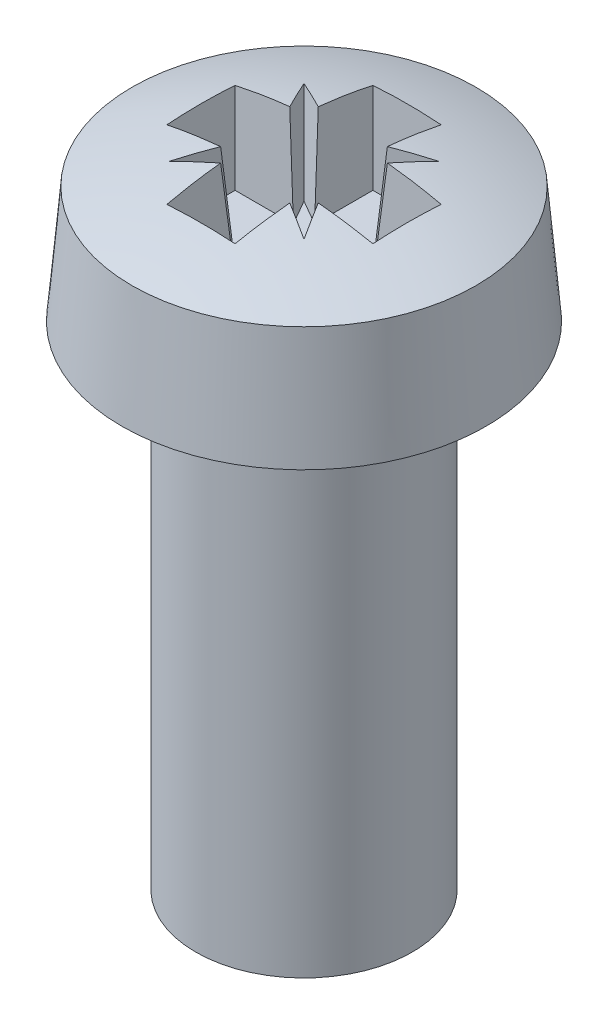
ISO-10303-21;
HEADER;
FILE_DESCRIPTION(('STEP AP214'),'2;1');
FILE_NAME('part.step','',(''),(''),'','','');
FILE_SCHEMA(('AUTOMOTIVE_DESIGN { 1 0 10303 214 1 1 1 1 }'));
ENDSEC;
DATA;
#1=APPLICATION_CONTEXT('core data for automotive mechanical design processes');
#2=APPLICATION_PROTOCOL_DEFINITION('international standard','automotive_design',2000,#1);
#3=PRODUCT_CONTEXT('',#1,'mechanical');
#4=PRODUCT('Part','Part','',(#3));
#5=PRODUCT_RELATED_PRODUCT_CATEGORY('part','',(#4));
#6=PRODUCT_DEFINITION_FORMATION('','',#4);
#7=PRODUCT_DEFINITION_CONTEXT('part definition',#1,'design');
#8=PRODUCT_DEFINITION('design','',#6,#7);
#9=PRODUCT_DEFINITION_SHAPE('','',#8);
#10=(LENGTH_UNIT() NAMED_UNIT(*) SI_UNIT(.MILLI.,.METRE.));
#11=(NAMED_UNIT(*) PLANE_ANGLE_UNIT() SI_UNIT($,.RADIAN.));
#12=(NAMED_UNIT(*) SI_UNIT($,.STERADIAN.) SOLID_ANGLE_UNIT());
#13=UNCERTAINTY_MEASURE_WITH_UNIT(LENGTH_MEASURE(1.E-05),#10,'distance_accuracy_value','');
#14=(GEOMETRIC_REPRESENTATION_CONTEXT(3) GLOBAL_UNCERTAINTY_ASSIGNED_CONTEXT((#13)) GLOBAL_UNIT_ASSIGNED_CONTEXT((#10,
#11,#12)) REPRESENTATION_CONTEXT('',''));
#15=CARTESIAN_POINT('',(0.,0.,0.));
#16=DIRECTION('',(0.,0.,1.));
#17=DIRECTION('',(1.,0.,0.));
#18=AXIS2_PLACEMENT_3D('',#15,#16,#17);
#19=CARTESIAN_POINT('',(0.,0.5,0.));
#20=DIRECTION('',(0.,-1.,0.));
#21=DIRECTION('',(0.,0.,-1.));
#22=AXIS2_PLACEMENT_3D('',#19,#20,#21);
#23=PLANE('',#22);
#24=DIRECTION('',(0.,0.,1.));
#25=VECTOR('',#24,1.);
#26=CARTESIAN_POINT('',(1.00042521936222,0.5,0.4));
#27=LINE('',#26,#25);
#28=CARTESIAN_POINT('',(1.00042521936222,0.499999999999999,0.300425219362222));
#29=VERTEX_POINT('',#28);
#30=CARTESIAN_POINT('',(1.00042521936222,0.5,-0.300425219362221));
#31=VERTEX_POINT('',#30);
#32=EDGE_CURVE('E348',#29,#31,#27,.F.);
#33=ORIENTED_EDGE('',*,*,#32,.T.);
#34=DIRECTION('',(1.,0.,0.));
#35=VECTOR('',#34,1.);
#36=CARTESIAN_POINT('',(0.580745002643809,0.5,-0.300425219362221));
#37=LINE('',#36,#35);
#38=CARTESIAN_POINT('',(0.408276423426651,0.499999999999999,-0.300425219362221));
#39=VERTEX_POINT('',#38);
#40=EDGE_CURVE('E418',#31,#39,#37,.F.);
#41=ORIENTED_EDGE('',*,*,#40,.T.);
#42=DIRECTION('',(0.5,0.,-0.866025403784439));
#43=VECTOR('',#42,1.);
#44=CARTESIAN_POINT('',(0.49451071303523,0.499999999999999,-0.449787390318889));
#45=LINE('',#44,#43);
#46=CARTESIAN_POINT('',(0.555603908007403,0.499999999999999,-0.555603908007405));
#47=VERTEX_POINT('',#46);
#48=EDGE_CURVE('E429',#39,#47,#45,.T.);
#49=ORIENTED_EDGE('',*,*,#48,.T.);
#50=DIRECTION('',(-0.866025403784437,0.,0.500000000000003));
#51=VECTOR('',#50,1.);
#52=CARTESIAN_POINT('',(0.87743465818123,0.499999999999999,-0.741412978253765));
#53=LINE('',#52,#51);
#54=CARTESIAN_POINT('',(0.300425219362221,0.499999999999999,-0.408276423426653));
#55=VERTEX_POINT('',#54);
#56=EDGE_CURVE('E434',#47,#55,#53,.T.);
#57=ORIENTED_EDGE('',*,*,#56,.T.);
#58=DIRECTION('',(0.,0.,1.));
#59=VECTOR('',#58,1.);
#60=CARTESIAN_POINT('',(0.300425219362221,0.5,-1.1));
#61=LINE('',#60,#59);
#62=CARTESIAN_POINT('',(0.300425219362221,0.5,-1.00042521936222));
#63=VERTEX_POINT('',#62);
#64=EDGE_CURVE('E439',#55,#63,#61,.F.);
#65=ORIENTED_EDGE('',*,*,#64,.T.);
#66=DIRECTION('',(1.,0.,0.));
#67=VECTOR('',#66,1.);
#68=CARTESIAN_POINT('',(-0.4,0.5,-1.00042521936222));
#69=LINE('',#68,#67);
#70=CARTESIAN_POINT('',(-0.300425219362221,0.5,-1.00042521936222));
#71=VERTEX_POINT('',#70);
#72=EDGE_CURVE('E444',#63,#71,#69,.F.);
#73=ORIENTED_EDGE('',*,*,#72,.T.);
#74=DIRECTION('',(0.,0.,1.));
#75=VECTOR('',#74,1.);
#76=CARTESIAN_POINT('',(-0.300425219362221,0.5,-1.1));
#77=LINE('',#76,#75);
#78=CARTESIAN_POINT('',(-0.300425219362221,0.5,-0.408276423426653));
#79=VERTEX_POINT('',#78);
#80=EDGE_CURVE('E449',#71,#79,#77,.T.);
#81=ORIENTED_EDGE('',*,*,#80,.T.);
#82=DIRECTION('',(-0.866025403784437,0.,-0.500000000000003));
#83=VECTOR('',#82,1.);
#84=CARTESIAN_POINT('',(-0.87743465818123,0.499999999999999,-0.741412978253765));
#85=LINE('',#84,#83);
#86=CARTESIAN_POINT('',(-0.555603908007403,0.499999999999999,-0.555603908007405));
#87=VERTEX_POINT('',#86);
#88=EDGE_CURVE('E454',#79,#87,#85,.T.);
#89=ORIENTED_EDGE('',*,*,#88,.T.);
#90=DIRECTION('',(0.5,0.,0.866025403784439));
#91=VECTOR('',#90,1.);
#92=CARTESIAN_POINT('',(-0.49451071303523,0.499999999999999,-0.449787390318889));
#93=LINE('',#92,#91);
#94=CARTESIAN_POINT('',(-0.408276423426651,0.499999999999999,-0.300425219362221));
#95=VERTEX_POINT('',#94);
#96=EDGE_CURVE('E459',#87,#95,#93,.T.);
#97=ORIENTED_EDGE('',*,*,#96,.T.);
#98=DIRECTION('',(1.,0.,0.));
#99=VECTOR('',#98,1.);
#100=CARTESIAN_POINT('',(-0.580745002643809,0.499999999999999,-0.300425219362221));
#101=LINE('',#100,#99);
#102=CARTESIAN_POINT('',(-1.00042521936222,0.499999999999999,-0.300425219362221));
#103=VERTEX_POINT('',#102);
#104=EDGE_CURVE('E464',#95,#103,#101,.F.);
#105=ORIENTED_EDGE('',*,*,#104,.T.);
#106=DIRECTION('',(0.,0.,1.));
#107=VECTOR('',#106,1.);
#108=CARTESIAN_POINT('',(-1.00042521936222,0.5,0.4));
#109=LINE('',#108,#107);
#110=CARTESIAN_POINT('',(-1.00042521936222,0.5,0.300425219362222));
#111=VERTEX_POINT('',#110);
#112=EDGE_CURVE('E469',#103,#111,#109,.T.);
#113=ORIENTED_EDGE('',*,*,#112,.T.);
#114=DIRECTION('',(1.,0.,0.));
#115=VECTOR('',#114,1.);
#116=CARTESIAN_POINT('',(-0.580745002643809,0.5,0.300425219362221));
#117=LINE('',#116,#115);
#118=CARTESIAN_POINT('',(-0.408276423426651,0.5,0.300425219362221));
#119=VERTEX_POINT('',#118);
#120=EDGE_CURVE('E474',#111,#119,#117,.T.);
#121=ORIENTED_EDGE('',*,*,#120,.T.);
#122=DIRECTION('',(-0.499999999999999,0.,0.866025403784439));
#123=VECTOR('',#122,1.);
#124=CARTESIAN_POINT('',(-0.49451071303523,0.499999999999999,0.449787390318889));
#125=LINE('',#124,#123);
#126=CARTESIAN_POINT('',(-0.555603908007403,0.5,0.555603908007405));
#127=VERTEX_POINT('',#126);
#128=EDGE_CURVE('E479',#119,#127,#125,.T.);
#129=ORIENTED_EDGE('',*,*,#128,.T.);
#130=DIRECTION('',(0.866025403784437,0.,-0.500000000000003));
#131=VECTOR('',#130,1.);
#132=CARTESIAN_POINT('',(-0.87743465818123,0.5,0.741412978253765));
#133=LINE('',#132,#131);
#134=CARTESIAN_POINT('',(-0.300425219362221,0.5,0.408276423426652));
#135=VERTEX_POINT('',#134);
#136=EDGE_CURVE('E484',#127,#135,#133,.T.);
#137=ORIENTED_EDGE('',*,*,#136,.T.);
#138=DIRECTION('',(0.,0.,1.));
#139=VECTOR('',#138,1.);
#140=CARTESIAN_POINT('',(-0.300425219362222,0.5,1.1));
#141=LINE('',#140,#139);
#142=CARTESIAN_POINT('',(-0.300425219362221,0.5,1.00042521936222));
#143=VERTEX_POINT('',#142);
#144=EDGE_CURVE('E489',#135,#143,#141,.T.);
#145=ORIENTED_EDGE('',*,*,#144,.T.);
#146=DIRECTION('',(1.,0.,0.));
#147=VECTOR('',#146,1.);
#148=CARTESIAN_POINT('',(-0.4,0.5,1.00042521936222));
#149=LINE('',#148,#147);
#150=CARTESIAN_POINT('',(0.300425219362221,0.5,1.00042521936222));
#151=VERTEX_POINT('',#150);
#152=EDGE_CURVE('E494',#143,#151,#149,.T.);
#153=ORIENTED_EDGE('',*,*,#152,.T.);
#154=DIRECTION('',(0.,0.,1.));
#155=VECTOR('',#154,1.);
#156=CARTESIAN_POINT('',(0.300425219362222,0.5,1.1));
#157=LINE('',#156,#155);
#158=CARTESIAN_POINT('',(0.300425219362221,0.5,0.408276423426653));
#159=VERTEX_POINT('',#158);
#160=EDGE_CURVE('E499',#151,#159,#157,.F.);
#161=ORIENTED_EDGE('',*,*,#160,.T.);
#162=DIRECTION('',(0.866025403784437,0.,0.500000000000003));
#163=VECTOR('',#162,1.);
#164=CARTESIAN_POINT('',(0.87743465818123,0.5,0.741412978253765));
#165=LINE('',#164,#163);
#166=CARTESIAN_POINT('',(0.555603908007403,0.5,0.555603908007405));
#167=VERTEX_POINT('',#166);
#168=EDGE_CURVE('E401',#159,#167,#165,.T.);
#169=ORIENTED_EDGE('',*,*,#168,.T.);
#170=DIRECTION('',(-0.499999999999999,0.,-0.866025403784439));
#171=VECTOR('',#170,1.);
#172=CARTESIAN_POINT('',(0.49451071303523,0.5,0.449787390318889));
#173=LINE('',#172,#171);
#174=CARTESIAN_POINT('',(0.408276423426651,0.5,0.300425219362221));
#175=VERTEX_POINT('',#174);
#176=EDGE_CURVE('E403',#167,#175,#173,.T.);
#177=ORIENTED_EDGE('',*,*,#176,.T.);
#178=DIRECTION('',(1.,0.,0.));
#179=VECTOR('',#178,1.);
#180=CARTESIAN_POINT('',(0.580745002643809,0.499999999999999,0.300425219362221));
#181=LINE('',#180,#179);
#182=EDGE_CURVE('E404',#175,#29,#181,.T.);
#183=ORIENTED_EDGE('',*,*,#182,.T.);
#184=EDGE_LOOP('',(#33,#41,#49,#57,#65,#73,#81,#89,#97,#105,#113,#121,#129,#137,#145,#153,#161,
#169,#177,#183));
#185=FACE_BOUND('',#184,.T.);
#186=ADVANCED_FACE('F17',(#185),#23,.F.);
#187=CARTESIAN_POINT('',(0.580745002643809,2.4,0.4));
#188=DIRECTION('',(0.,-0.052335956242944,0.998629534754574));
#189=DIRECTION('',(0.,-0.998629534754574,-0.052335956242944));
#190=AXIS2_PLACEMENT_3D('',#187,#188,#189);
#191=PLANE('',#190);
#192=DIRECTION('',(-0.0522644276887139,-0.997264688634237,-0.0522644276887141));
#193=VECTOR('',#192,1.);
#194=CARTESIAN_POINT('',(1.04638663921927,1.37699613465438,0.346386639219269));
#195=LINE('',#194,#193);
#196=CARTESIAN_POINT('',(1.04638663921927,1.37699613465438,0.346386639219269));
#197=VERTEX_POINT('',#196);
#198=EDGE_CURVE('E113',#197,#29,#195,.T.);
#199=ORIENTED_EDGE('',*,*,#198,.T.);
#200=ORIENTED_EDGE('',*,*,#182,.F.);
#201=DIRECTION('',(0.0902783783273544,0.994551700956488,0.0521222460293011));
#202=VECTOR('',#201,1.);
#203=CARTESIAN_POINT('',(0.408276423426651,0.499999999999999,0.300425219362221));
#204=LINE('',#203,#202);
#205=CARTESIAN_POINT('',(0.495688911325319,1.4629796207595,0.350892842781052));
#206=VERTEX_POINT('',#205);
#207=EDGE_CURVE('E341',#175,#206,#204,.T.);
#208=ORIENTED_EDGE('',*,*,#207,.T.);
#209=CARTESIAN_POINT('',(1.04638663921927,1.37699613465438,0.346386639219269));
#210=CARTESIAN_POINT('',(0.955404304317571,1.39644039329686,0.347405669634527));
#211=CARTESIAN_POINT('',(0.864021659542226,1.41332781312686,0.348290701805637));
#212=CARTESIAN_POINT('',(0.680455750244243,1.4419889751619,0.349792769659564));
#213=CARTESIAN_POINT('',(0.588272485721604,1.45376271736694,0.350409805342381));
#214=CARTESIAN_POINT('',(0.495688911325318,1.4629796207595,0.350892842781051));
#215=B_SPLINE_CURVE_WITH_KNOTS('',3,(#209,#210,#211,#212,#213,#214),.UNSPECIFIED.,.F.,.F.,(4,2,
4),(0.,0.278802446132308,0.557604892264617),.UNSPECIFIED.);
#216=EDGE_CURVE('E20',#197,#206,#215,.T.);
#217=ORIENTED_EDGE('',*,*,#216,.F.);
#218=EDGE_LOOP('',(#199,#200,#208,#217));
#219=FACE_BOUND('',#218,.T.);
#220=ADVANCED_FACE('F337',(#219),#191,.F.);
#221=CARTESIAN_POINT('',(0.580745002643809,2.4,0.4));
#222=DIRECTION('',(0.864838546066896,-0.052335956242944,-0.499314767377286));
#223=DIRECTION('',(-0.499999999999999,0.,-0.866025403784439));
#224=AXIS2_PLACEMENT_3D('',#221,#222,#223);
#225=PLANE('',#224);
#226=ORIENTED_EDGE('',*,*,#207,.F.);
#227=ORIENTED_EDGE('',*,*,#176,.F.);
#228=DIRECTION('',(0.14033269477898,0.980108906985412,0.140332694778981));
#229=VECTOR('',#228,1.);
#230=CARTESIAN_POINT('',(0.555603908007403,0.500000000000001,0.555603908007405));
#231=LINE('',#230,#229);
#232=CARTESIAN_POINT('',(0.685210874060292,1.40519847877117,0.685210874060295));
#233=VERTEX_POINT('',#232);
#234=EDGE_CURVE('E410',#167,#233,#231,.T.);
#235=ORIENTED_EDGE('',*,*,#234,.T.);
#236=CARTESIAN_POINT('',(0.495688911325318,1.4629796207595,0.350892842781052));
#237=CARTESIAN_POINT('',(0.527576213956878,1.45583600184254,0.406872033462203));
#238=CARTESIAN_POINT('',(0.559313362167239,1.44744909721836,0.462721464742716));
#239=CARTESIAN_POINT('',(0.622487349745564,1.42818871655558,0.574160808502464));
#240=CARTESIAN_POINT('',(0.653924189113528,1.41731524051698,0.629750720981699));
#241=CARTESIAN_POINT('',(0.685210874060294,1.40519847877118,0.685210874060295));
#242=B_SPLINE_CURVE_WITH_KNOTS('',3,(#236,#237,#238,#239,#240,#241),.UNSPECIFIED.,.F.,.F.,(4,2,
4),(0.,0.194346884411672,0.388693768823343),.UNSPECIFIED.);
#243=EDGE_CURVE('E329',#206,#233,#242,.T.);
#244=ORIENTED_EDGE('',*,*,#243,.F.);
#245=EDGE_LOOP('',(#226,#227,#235,#244));
#246=FACE_BOUND('',#245,.T.);
#247=ADVANCED_FACE('F320',(#246),#225,.F.);
#248=CARTESIAN_POINT('',(0.827647267862341,2.4,0.827647267862344));
#249=DIRECTION('',(-0.49931476737729,-0.052335956242944,0.864838546066894));
#250=DIRECTION('',(0.866025403784437,0.,0.500000000000003));
#251=AXIS2_PLACEMENT_3D('',#248,#249,#250);
#252=PLANE('',#251);
#253=ORIENTED_EDGE('',*,*,#234,.F.);
#254=ORIENTED_EDGE('',*,*,#168,.F.);
#255=DIRECTION('',(0.052122246029301,0.994551700956488,0.0902783783273547));
#256=VECTOR('',#255,1.);
#257=CARTESIAN_POINT('',(0.300425219362221,0.5,0.408276423426653));
#258=LINE('',#257,#256);
#259=CARTESIAN_POINT('',(0.350892842780307,1.46297962074529,0.495688911468197));
#260=VERTEX_POINT('',#259);
#261=EDGE_CURVE('E496',#159,#260,#258,.T.);
#262=ORIENTED_EDGE('',*,*,#261,.T.);
#263=CARTESIAN_POINT('',(0.685210874060292,1.40519847877118,0.685210874060296));
#264=CARTESIAN_POINT('',(0.629750721063942,1.41731524049902,0.653924189159928));
#265=CARTESIAN_POINT('',(0.574160808667275,1.42818871652335,0.622487349838771));
#266=CARTESIAN_POINT('',(0.462721465073309,1.44744909716497,0.559313362354879));
#267=CARTESIAN_POINT('',(0.406872033876009,1.45583600178227,0.527576214192143));
#268=CARTESIAN_POINT('',(0.350892843278393,1.46297962069605,0.495688911608619));
#269=B_SPLINE_CURVE_WITH_KNOTS('',3,(#263,#264,#265,#266,#267,#268),.UNSPECIFIED.,.F.,.F.,(4,2,
4),(0.,0.194346884123787,0.388693768247573),.UNSPECIFIED.);
#270=EDGE_CURVE('E323',#233,#260,#269,.T.);
#271=ORIENTED_EDGE('',*,*,#270,.F.);
#272=EDGE_LOOP('',(#253,#254,#262,#271));
#273=FACE_BOUND('',#272,.T.);
#274=ADVANCED_FACE('F315',(#273),#252,.F.);
#275=CARTESIAN_POINT('',(0.4,2.4,1.1));
#276=DIRECTION('',(0.998629534754574,-0.052335956242944,0.));
#277=DIRECTION('',(0.052335956242944,0.998629534754574,0.));
#278=AXIS2_PLACEMENT_3D('',#275,#276,#277);
#279=PLANE('',#278);
#280=ORIENTED_EDGE('',*,*,#261,.F.);
#281=ORIENTED_EDGE('',*,*,#160,.F.);
#282=DIRECTION('',(0.0522644276887144,0.997264688634237,0.0522644276887139));
#283=VECTOR('',#282,1.);
#284=CARTESIAN_POINT('',(0.300425219362221,0.5,1.00042521936222));
#285=LINE('',#284,#283);
#286=CARTESIAN_POINT('',(0.346386639219269,1.37699613465438,1.04638663921927));
#287=VERTEX_POINT('',#286);
#288=EDGE_CURVE('E491',#151,#287,#285,.T.);
#289=ORIENTED_EDGE('',*,*,#288,.T.);
#290=CARTESIAN_POINT('',(0.350892842779562,1.46297962073107,0.495688911611073));
#291=CARTESIAN_POINT('',(0.350409805340863,1.45376271733796,0.588272485959056));
#292=CARTESIAN_POINT('',(0.349792769658155,1.44198897513501,0.68045575043373));
#293=CARTESIAN_POINT('',(0.348290701804724,1.41332781310945,0.864021659636462));
#294=CARTESIAN_POINT('',(0.347405669634001,1.39644039328684,0.95540430436452));
#295=CARTESIAN_POINT('',(0.346386639219269,1.37699613465438,1.04638663921927));
#296=B_SPLINE_CURVE_WITH_KNOTS('',3,(#290,#291,#292,#293,#294,#295),.UNSPECIFIED.,.F.,.F.,(4,2,
4),(0.,0.278802445988779,0.557604891977559),.UNSPECIFIED.);
#297=EDGE_CURVE('E300',#260,#287,#296,.T.);
#298=ORIENTED_EDGE('',*,*,#297,.F.);
#299=EDGE_LOOP('',(#280,#281,#289,#298));
#300=FACE_BOUND('',#299,.T.);
#301=ADVANCED_FACE('F310',(#300),#279,.F.);
#302=CARTESIAN_POINT('',(-0.4,2.4,1.1));
#303=DIRECTION('',(0.,-0.052335956242944,0.998629534754574));
#304=DIRECTION('',(0.,-0.998629534754574,-0.052335956242944));
#305=AXIS2_PLACEMENT_3D('',#302,#303,#304);
#306=PLANE('',#305);
#307=ORIENTED_EDGE('',*,*,#288,.F.);
#308=ORIENTED_EDGE('',*,*,#152,.F.);
#309=DIRECTION('',(-0.052264427688714,0.997264688634237,0.0522644276887139));
#310=VECTOR('',#309,1.);
#311=CARTESIAN_POINT('',(-0.300425219362221,0.5,1.00042521936222));
#312=LINE('',#311,#310);
#313=CARTESIAN_POINT('',(-0.346386639219269,1.37699613465438,1.04638663921927));
#314=VERTEX_POINT('',#313);
#315=EDGE_CURVE('E486',#143,#314,#312,.T.);
#316=ORIENTED_EDGE('',*,*,#315,.T.);
#317=CARTESIAN_POINT('',(0.346386639219269,1.37699613465438,1.04638663921927));
#318=CARTESIAN_POINT('',(0.230924426146179,1.38509560114501,1.04681111427142));
#319=CARTESIAN_POINT('',(0.11546221307309,1.38914533439033,1.0470233517975));
#320=CARTESIAN_POINT('',(-0.115462213073089,1.38914533439033,1.0470233517975));
#321=CARTESIAN_POINT('',(-0.230924426146179,1.38509560114501,1.04681111427142));
#322=CARTESIAN_POINT('',(-0.346386639219269,1.37699613465438,1.04638663921927));
#323=B_SPLINE_CURVE_WITH_KNOTS('',3,(#317,#318,#319,#320,#321,#322),.UNSPECIFIED.,.F.,.F.,(4,2,
4),(0.,0.34660021968653,0.693200439373061),.UNSPECIFIED.);
#324=EDGE_CURVE('E293',#287,#314,#323,.T.);
#325=ORIENTED_EDGE('',*,*,#324,.F.);
#326=EDGE_LOOP('',(#307,#308,#316,#325));
#327=FACE_BOUND('',#326,.T.);
#328=ADVANCED_FACE('F307',(#327),#306,.F.);
#329=CARTESIAN_POINT('',(-0.4,2.4,1.1));
#330=DIRECTION('',(-0.998629534754574,-0.052335956242944,0.));
#331=DIRECTION('',(0.052335956242944,-0.998629534754574,0.));
#332=AXIS2_PLACEMENT_3D('',#329,#330,#331);
#333=PLANE('',#332);
#334=ORIENTED_EDGE('',*,*,#315,.F.);
#335=ORIENTED_EDGE('',*,*,#144,.F.);
#336=DIRECTION('',(-0.0521222460293012,0.994551700956488,0.0902783783273549));
#337=VECTOR('',#336,1.);
#338=CARTESIAN_POINT('',(-0.300425219362221,0.500000000000001,0.408276423426653));
#339=LINE('',#338,#337);
#340=CARTESIAN_POINT('',(-0.350892842903528,1.46297962074388,0.495688911395087));
#341=VERTEX_POINT('',#340);
#342=EDGE_CURVE('E481',#135,#341,#339,.T.);
#343=ORIENTED_EDGE('',*,*,#342,.T.);
#344=CARTESIAN_POINT('',(-0.346386639219269,1.37699613465438,1.04638663921927));
#345=CARTESIAN_POINT('',(-0.347405669633474,1.39644039327679,0.955404304411547));
#346=CARTESIAN_POINT('',(-0.34829070180381,1.41332781309201,0.864021659730855));
#347=CARTESIAN_POINT('',(-0.349792769656744,1.44198897510808,0.680455750623534));
#348=CARTESIAN_POINT('',(-0.350409805339341,1.45376271730893,0.588272486196904));
#349=CARTESIAN_POINT('',(-0.350892842778068,1.46297962070259,0.495688911897305));
#350=B_SPLINE_CURVE_WITH_KNOTS('',3,(#344,#345,#346,#347,#348,#349),.UNSPECIFIED.,.F.,.F.,(4,2,
4),(0.,0.278802445845011,0.557604891690021),.UNSPECIFIED.);
#351=EDGE_CURVE('E286',#314,#341,#350,.T.);
#352=ORIENTED_EDGE('',*,*,#351,.F.);
#353=EDGE_LOOP('',(#334,#335,#343,#352));
#354=FACE_BOUND('',#353,.T.);
#355=ADVANCED_FACE('F275',(#354),#333,.F.);
#356=CARTESIAN_POINT('',(-0.827647267862341,2.4,0.827647267862344));
#357=DIRECTION('',(0.49931476737729,-0.052335956242944,0.864838546066894));
#358=DIRECTION('',(0.866025403784437,0.,-0.500000000000003));
#359=AXIS2_PLACEMENT_3D('',#356,#357,#358);
#360=PLANE('',#359);
#361=ORIENTED_EDGE('',*,*,#342,.F.);
#362=ORIENTED_EDGE('',*,*,#136,.F.);
#363=DIRECTION('',(-0.14033269477898,0.980108906985412,0.140332694778981));
#364=VECTOR('',#363,1.);
#365=CARTESIAN_POINT('',(-0.555603908007403,0.499999999999999,0.555603908007405));
#366=LINE('',#365,#364);
#367=CARTESIAN_POINT('',(-0.685210874060293,1.40519847877117,0.685210874060295));
#368=VERTEX_POINT('',#367);
#369=EDGE_CURVE('E476',#127,#368,#366,.T.);
#370=ORIENTED_EDGE('',*,*,#369,.T.);
#371=CARTESIAN_POINT('',(-0.350892843026005,1.46297962072825,0.495688911464853));
#372=CARTESIAN_POINT('',(-0.406872033666013,1.45583600181285,0.527576214072754));
#373=CARTESIAN_POINT('',(-0.462721464905541,1.44744909719206,0.559313362259658));
#374=CARTESIAN_POINT('',(-0.574160808583637,1.42818871653971,0.622487349791472));
#375=CARTESIAN_POINT('',(-0.629750721022204,1.41731524050814,0.653924189136383));
#376=CARTESIAN_POINT('',(-0.685210874060291,1.40519847877118,0.685210874060297));
#377=B_SPLINE_CURVE_WITH_KNOTS('',3,(#371,#372,#373,#374,#375,#376),.UNSPECIFIED.,.F.,.F.,(4,2,
4),(0.,0.19434688426988,0.388693768539759),.UNSPECIFIED.);
#378=EDGE_CURVE('E279',#341,#368,#377,.T.);
#379=ORIENTED_EDGE('',*,*,#378,.F.);
#380=EDGE_LOOP('',(#361,#362,#370,#379));
#381=FACE_BOUND('',#380,.T.);
#382=ADVANCED_FACE('F270',(#381),#360,.F.);
#383=CARTESIAN_POINT('',(-0.580745002643809,2.4,0.4));
#384=DIRECTION('',(-0.864838546066896,-0.052335956242944,-0.499314767377286));
#385=DIRECTION('',(-0.499999999999999,0.,0.866025403784439));
#386=AXIS2_PLACEMENT_3D('',#383,#384,#385);
#387=PLANE('',#386);
#388=ORIENTED_EDGE('',*,*,#369,.F.);
#389=ORIENTED_EDGE('',*,*,#128,.F.);
#390=DIRECTION('',(-0.0902783783273544,0.994551700956488,0.052122246029301));
#391=VECTOR('',#390,1.);
#392=CARTESIAN_POINT('',(-0.408276423426651,0.499999999999999,0.300425219362221));
#393=LINE('',#392,#391);
#394=CARTESIAN_POINT('',(-0.495688911325319,1.4629796207595,0.350892842781052));
#395=VERTEX_POINT('',#394);
#396=EDGE_CURVE('E471',#119,#395,#393,.T.);
#397=ORIENTED_EDGE('',*,*,#396,.T.);
#398=CARTESIAN_POINT('',(-0.685210874060293,1.40519847877118,0.685210874060296));
#399=CARTESIAN_POINT('',(-0.653924189113528,1.41731524051698,0.629750720981699));
#400=CARTESIAN_POINT('',(-0.622487349745564,1.42818871655558,0.574160808502464));
#401=CARTESIAN_POINT('',(-0.559313362167239,1.44744909721836,0.462721464742716));
#402=CARTESIAN_POINT('',(-0.527576213956878,1.45583600184254,0.406872033462203));
#403=CARTESIAN_POINT('',(-0.495688911325318,1.4629796207595,0.350892842781052));
#404=B_SPLINE_CURVE_WITH_KNOTS('',3,(#398,#399,#400,#401,#402,#403),.UNSPECIFIED.,.F.,.F.,(4,2,
4),(0.,0.194346884411672,0.388693768823343),.UNSPECIFIED.);
#405=EDGE_CURVE('E255',#368,#395,#404,.T.);
#406=ORIENTED_EDGE('',*,*,#405,.F.);
#407=EDGE_LOOP('',(#388,#389,#397,#406));
#408=FACE_BOUND('',#407,.T.);
#409=ADVANCED_FACE('F265',(#408),#387,.F.);
#410=CARTESIAN_POINT('',(-0.580745002643809,2.4,0.4));
#411=DIRECTION('',(0.,-0.052335956242944,0.998629534754574));
#412=DIRECTION('',(0.,-0.998629534754574,-0.052335956242944));
#413=AXIS2_PLACEMENT_3D('',#410,#411,#412);
#414=PLANE('',#413);
#415=ORIENTED_EDGE('',*,*,#396,.F.);
#416=ORIENTED_EDGE('',*,*,#120,.F.);
#417=DIRECTION('',(-0.052264427688714,0.997264688634237,0.0522644276887141));
#418=VECTOR('',#417,1.);
#419=CARTESIAN_POINT('',(-1.00042521936222,0.5,0.300425219362222));
#420=LINE('',#419,#418);
#421=CARTESIAN_POINT('',(-1.04638663921927,1.37699613465438,0.346386639219269));
#422=VERTEX_POINT('',#421);
#423=EDGE_CURVE('E466',#111,#422,#420,.T.);
#424=ORIENTED_EDGE('',*,*,#423,.T.);
#425=CARTESIAN_POINT('',(-0.495688911325318,1.4629796207595,0.350892842781052));
#426=CARTESIAN_POINT('',(-0.588272485721604,1.45376271736694,0.350409805342381));
#427=CARTESIAN_POINT('',(-0.680455750244243,1.4419889751619,0.349792769659564));
#428=CARTESIAN_POINT('',(-0.864021659542226,1.41332781312686,0.348290701805637));
#429=CARTESIAN_POINT('',(-0.955404304317571,1.39644039329686,0.347405669634527));
#430=CARTESIAN_POINT('',(-1.04638663921927,1.37699613465438,0.346386639219269));
#431=B_SPLINE_CURVE_WITH_KNOTS('',3,(#425,#426,#427,#428,#429,#430),.UNSPECIFIED.,.F.,.F.,(4,2,
4),(0.,0.278802446132308,0.557604892264617),.UNSPECIFIED.);
#432=EDGE_CURVE('E247',#395,#422,#431,.T.);
#433=ORIENTED_EDGE('',*,*,#432,.F.);
#434=EDGE_LOOP('',(#415,#416,#424,#433));
#435=FACE_BOUND('',#434,.T.);
#436=ADVANCED_FACE('F262',(#435),#414,.F.);
#437=CARTESIAN_POINT('',(-1.1,2.4,0.4));
#438=DIRECTION('',(-0.998629534754574,-0.052335956242944,0.));
#439=DIRECTION('',(0.052335956242944,-0.998629534754574,0.));
#440=AXIS2_PLACEMENT_3D('',#437,#438,#439);
#441=PLANE('',#440);
#442=CARTESIAN_POINT('',(-1.04638663921927,1.37699613465438,0.346386639219269));
#443=CARTESIAN_POINT('',(-1.0470233517975,1.38914533439033,0.173406965923271));
#444=CARTESIAN_POINT('',(-1.0470233517975,1.38914533439033,0.));
#445=B_SPLINE_CURVE_WITH_KNOTS('',2,(#442,#443,#444),.UNSPECIFIED.,.F.,.F.,(3,3),(0.,1.),.UNSPECIFIED.);
#446=CARTESIAN_POINT('',(-1.0470233517975,1.38914533439033,0.));
#447=VERTEX_POINT('',#446);
#448=EDGE_CURVE('E254',#422,#447,#445,.T.);
#449=ORIENTED_EDGE('',*,*,#448,.F.);
#450=ORIENTED_EDGE('',*,*,#423,.F.);
#451=ORIENTED_EDGE('',*,*,#112,.F.);
#452=DIRECTION('',(-0.0522644276887137,0.997264688634237,-0.0522644276887139));
#453=VECTOR('',#452,1.);
#454=CARTESIAN_POINT('',(-1.00042521936222,0.5,-0.300425219362221));
#455=LINE('',#454,#453);
#456=CARTESIAN_POINT('',(-1.04638663921927,1.37699613465438,-0.346386639219268));
#457=VERTEX_POINT('',#456);
#458=EDGE_CURVE('E461',#103,#457,#455,.T.);
#459=ORIENTED_EDGE('',*,*,#458,.T.);
#460=CARTESIAN_POINT('',(-1.0470233517975,1.38914533439033,0.));
#461=CARTESIAN_POINT('',(-1.0470233517975,1.38914533439033,-0.173406965923272));
#462=CARTESIAN_POINT('',(-1.04638663921927,1.37699613465438,-0.346386639219268));
#463=B_SPLINE_CURVE_WITH_KNOTS('',2,(#460,#461,#462),.UNSPECIFIED.,.F.,.F.,(3,3),(0.,1.),.UNSPECIFIED.);
#464=EDGE_CURVE('E246',#447,#457,#463,.T.);
#465=ORIENTED_EDGE('',*,*,#464,.F.);
#466=EDGE_LOOP('',(#449,#450,#451,#459,#465));
#467=FACE_BOUND('',#466,.T.);
#468=ADVANCED_FACE('F235',(#467),#441,.F.);
#469=CARTESIAN_POINT('',(-0.580745002643809,2.4,-0.4));
#470=DIRECTION('',(0.,-0.052335956242944,-0.998629534754574));
#471=DIRECTION('',(0.,0.998629534754574,-0.052335956242944));
#472=AXIS2_PLACEMENT_3D('',#469,#470,#471);
#473=PLANE('',#472);
#474=ORIENTED_EDGE('',*,*,#458,.F.);
#475=ORIENTED_EDGE('',*,*,#104,.F.);
#476=DIRECTION('',(-0.0902783783273544,0.994551700956488,-0.0521222460293009));
#477=VECTOR('',#476,1.);
#478=CARTESIAN_POINT('',(-0.408276423426651,0.499999999999999,-0.300425219362221));
#479=LINE('',#478,#477);
#480=CARTESIAN_POINT('',(-0.495688911325318,1.4629796207595,-0.350892842781052));
#481=VERTEX_POINT('',#480);
#482=EDGE_CURVE('E456',#95,#481,#479,.T.);
#483=ORIENTED_EDGE('',*,*,#482,.T.);
#484=CARTESIAN_POINT('',(-1.04638663921927,1.37699613465438,-0.346386639219268));
#485=CARTESIAN_POINT('',(-0.955404304317571,1.39644039329686,-0.347405669634525));
#486=CARTESIAN_POINT('',(-0.864021659542227,1.41332781312686,-0.348290701805636));
#487=CARTESIAN_POINT('',(-0.680455750244244,1.4419889751619,-0.349792769659565));
#488=CARTESIAN_POINT('',(-0.588272485721605,1.45376271736694,-0.350409805342382));
#489=CARTESIAN_POINT('',(-0.495688911325319,1.4629796207595,-0.350892842781053));
#490=B_SPLINE_CURVE_WITH_KNOTS('',3,(#484,#485,#486,#487,#488,#489),.UNSPECIFIED.,.F.,.F.,(4,2,
4),(0.,0.278802446132308,0.557604892264615),.UNSPECIFIED.);
#491=EDGE_CURVE('E239',#457,#481,#490,.T.);
#492=ORIENTED_EDGE('',*,*,#491,.F.);
#493=EDGE_LOOP('',(#474,#475,#483,#492));
#494=FACE_BOUND('',#493,.T.);
#495=ADVANCED_FACE('F230',(#494),#473,.F.);
#496=CARTESIAN_POINT('',(-0.580745002643809,2.4,-0.4));
#497=DIRECTION('',(-0.864838546066896,-0.052335956242944,0.499314767377287));
#498=DIRECTION('',(0.5,0.,0.866025403784439));
#499=AXIS2_PLACEMENT_3D('',#496,#497,#498);
#500=PLANE('',#499);
#501=ORIENTED_EDGE('',*,*,#482,.F.);
#502=ORIENTED_EDGE('',*,*,#96,.F.);
#503=DIRECTION('',(-0.14033269477898,0.980108906985412,-0.14033269477898));
#504=VECTOR('',#503,1.);
#505=CARTESIAN_POINT('',(-0.555603908007403,0.499999999999999,-0.555603908007405));
#506=LINE('',#505,#504);
#507=CARTESIAN_POINT('',(-0.685210874060292,1.40519847877117,-0.685210874060295));
#508=VERTEX_POINT('',#507);
#509=EDGE_CURVE('E451',#87,#508,#506,.T.);
#510=ORIENTED_EDGE('',*,*,#509,.T.);
#511=CARTESIAN_POINT('',(-0.495688911325318,1.4629796207595,-0.350892842781053));
#512=CARTESIAN_POINT('',(-0.527576213956878,1.45583600184254,-0.406872033462204));
#513=CARTESIAN_POINT('',(-0.559313362167239,1.44744909721836,-0.462721464742716));
#514=CARTESIAN_POINT('',(-0.622487349745564,1.42818871655558,-0.574160808502463));
#515=CARTESIAN_POINT('',(-0.653924189113527,1.41731524051698,-0.629750720981698));
#516=CARTESIAN_POINT('',(-0.685210874060291,1.40519847877118,-0.685210874060295));
#517=B_SPLINE_CURVE_WITH_KNOTS('',3,(#511,#512,#513,#514,#515,#516),.UNSPECIFIED.,.F.,.F.,(4,2,
4),(0.,0.19434688441167,0.388693768823341),.UNSPECIFIED.);
#518=EDGE_CURVE('E215',#481,#508,#517,.T.);
#519=ORIENTED_EDGE('',*,*,#518,.F.);
#520=EDGE_LOOP('',(#501,#502,#510,#519));
#521=FACE_BOUND('',#520,.T.);
#522=ADVANCED_FACE('F225',(#521),#500,.F.);
#523=CARTESIAN_POINT('',(-0.827647267862341,2.4,-0.827647267862344));
#524=DIRECTION('',(0.499314767377289,-0.052335956242944,-0.864838546066895));
#525=DIRECTION('',(-0.866025403784437,0.,-0.500000000000003));
#526=AXIS2_PLACEMENT_3D('',#523,#524,#525);
#527=PLANE('',#526);
#528=ORIENTED_EDGE('',*,*,#509,.F.);
#529=ORIENTED_EDGE('',*,*,#88,.F.);
#530=DIRECTION('',(-0.0521222460293009,0.994551700956488,-0.0902783783273545));
#531=VECTOR('',#530,1.);
#532=CARTESIAN_POINT('',(-0.300425219362221,0.5,-0.408276423426653));
#533=LINE('',#532,#531);
#534=CARTESIAN_POINT('',(-0.350892842780307,1.46297962074529,-0.495688911468198));
#535=VERTEX_POINT('',#534);
#536=EDGE_CURVE('E446',#79,#535,#533,.T.);
#537=ORIENTED_EDGE('',*,*,#536,.T.);
#538=CARTESIAN_POINT('',(-0.685210874060292,1.40519847877118,-0.685210874060295));
#539=CARTESIAN_POINT('',(-0.629750721063942,1.41731524049902,-0.653924189159927));
#540=CARTESIAN_POINT('',(-0.574160808667275,1.42818871652335,-0.62248734983877));
#541=CARTESIAN_POINT('',(-0.462721465073309,1.44744909716497,-0.559313362354879));
#542=CARTESIAN_POINT('',(-0.406872033876009,1.45583600178227,-0.527576214192144));
#543=CARTESIAN_POINT('',(-0.350892843278392,1.46297962069605,-0.49568891160862));
#544=B_SPLINE_CURVE_WITH_KNOTS('',3,(#538,#539,#540,#541,#542,#543),.UNSPECIFIED.,.F.,.F.,(4,2,
4),(0.,0.194346884123786,0.388693768247572),.UNSPECIFIED.);
#545=EDGE_CURVE('E208',#508,#535,#544,.T.);
#546=ORIENTED_EDGE('',*,*,#545,.F.);
#547=EDGE_LOOP('',(#528,#529,#537,#546));
#548=FACE_BOUND('',#547,.T.);
#549=ADVANCED_FACE('F222',(#548),#527,.F.);
#550=CARTESIAN_POINT('',(-0.4,2.4,-1.1));
#551=DIRECTION('',(-0.998629534754574,-0.052335956242944,0.));
#552=DIRECTION('',(0.052335956242944,-0.998629534754574,0.));
#553=AXIS2_PLACEMENT_3D('',#550,#551,#552);
#554=PLANE('',#553);
#555=ORIENTED_EDGE('',*,*,#536,.F.);
#556=ORIENTED_EDGE('',*,*,#80,.F.);
#557=DIRECTION('',(-0.0522644276887139,0.997264688634237,-0.0522644276887139));
#558=VECTOR('',#557,1.);
#559=CARTESIAN_POINT('',(-0.300425219362221,0.5,-1.00042521936222));
#560=LINE('',#559,#558);
#561=CARTESIAN_POINT('',(-0.346386639219269,1.37699613465438,-1.04638663921927));
#562=VERTEX_POINT('',#561);
#563=EDGE_CURVE('E441',#71,#562,#560,.T.);
#564=ORIENTED_EDGE('',*,*,#563,.T.);
#565=CARTESIAN_POINT('',(-0.350892842779561,1.46297962073107,-0.495688911611074));
#566=CARTESIAN_POINT('',(-0.350409805340862,1.45376271733796,-0.588272485959057));
#567=CARTESIAN_POINT('',(-0.349792769658155,1.44198897513501,-0.680455750433731));
#568=CARTESIAN_POINT('',(-0.348290701804724,1.41332781310945,-0.864021659636462));
#569=CARTESIAN_POINT('',(-0.347405669634001,1.39644039328684,-0.955404304364519));
#570=CARTESIAN_POINT('',(-0.346386639219269,1.37699613465438,-1.04638663921927));
#571=B_SPLINE_CURVE_WITH_KNOTS('',3,(#565,#566,#567,#568,#569,#570),.UNSPECIFIED.,.F.,.F.,(4,2,
4),(0.,0.278802445988778,0.557604891977556),.UNSPECIFIED.);
#572=EDGE_CURVE('E201',#535,#562,#571,.T.);
#573=ORIENTED_EDGE('',*,*,#572,.F.);
#574=EDGE_LOOP('',(#555,#556,#564,#573));
#575=FACE_BOUND('',#574,.T.);
#576=ADVANCED_FACE('F190',(#575),#554,.F.);
#577=CARTESIAN_POINT('',(-0.4,2.4,-1.1));
#578=DIRECTION('',(0.,-0.052335956242944,-0.998629534754574));
#579=DIRECTION('',(0.,0.998629534754574,-0.052335956242944));
#580=AXIS2_PLACEMENT_3D('',#577,#578,#579);
#581=PLANE('',#580);
#582=ORIENTED_EDGE('',*,*,#563,.F.);
#583=ORIENTED_EDGE('',*,*,#72,.F.);
#584=DIRECTION('',(0.0522644276887141,0.997264688634237,-0.0522644276887138));
#585=VECTOR('',#584,1.);
#586=CARTESIAN_POINT('',(0.300425219362221,0.5,-1.00042521936222));
#587=LINE('',#586,#585);
#588=CARTESIAN_POINT('',(0.346386639219269,1.37699613465438,-1.04638663921927));
#589=VERTEX_POINT('',#588);
#590=EDGE_CURVE('E436',#63,#589,#587,.T.);
#591=ORIENTED_EDGE('',*,*,#590,.T.);
#592=CARTESIAN_POINT('',(-0.346386639219269,1.37699613465438,-1.04638663921927));
#593=CARTESIAN_POINT('',(-0.230924426146179,1.38509560114501,-1.04681111427142));
#594=CARTESIAN_POINT('',(-0.115462213073089,1.38914533439033,-1.0470233517975));
#595=CARTESIAN_POINT('',(0.11546221307309,1.38914533439033,-1.0470233517975));
#596=CARTESIAN_POINT('',(0.230924426146179,1.38509560114501,-1.04681111427142));
#597=CARTESIAN_POINT('',(0.346386639219269,1.37699613465438,-1.04638663921927));
#598=B_SPLINE_CURVE_WITH_KNOTS('',3,(#592,#593,#594,#595,#596,#597),.UNSPECIFIED.,.F.,.F.,(4,2,
4),(0.,0.34660021968653,0.693200439373061),.UNSPECIFIED.);
#599=EDGE_CURVE('E194',#562,#589,#598,.T.);
#600=ORIENTED_EDGE('',*,*,#599,.F.);
#601=EDGE_LOOP('',(#582,#583,#591,#600));
#602=FACE_BOUND('',#601,.T.);
#603=ADVANCED_FACE('F185',(#602),#581,.F.);
#604=CARTESIAN_POINT('',(0.4,2.4,-1.1));
#605=DIRECTION('',(0.998629534754574,-0.052335956242944,0.));
#606=DIRECTION('',(0.052335956242944,0.998629534754574,0.));
#607=AXIS2_PLACEMENT_3D('',#604,#605,#606);
#608=PLANE('',#607);
#609=ORIENTED_EDGE('',*,*,#590,.F.);
#610=ORIENTED_EDGE('',*,*,#64,.F.);
#611=DIRECTION('',(0.052122246029301,0.994551700956488,-0.0902783783273548));
#612=VECTOR('',#611,1.);
#613=CARTESIAN_POINT('',(0.300425219362221,0.499999999999999,-0.408276423426653));
#614=LINE('',#613,#612);
#615=CARTESIAN_POINT('',(0.350892842903529,1.46297962074388,-0.495688911395088));
#616=VERTEX_POINT('',#615);
#617=EDGE_CURVE('E431',#55,#616,#614,.T.);
#618=ORIENTED_EDGE('',*,*,#617,.T.);
#619=CARTESIAN_POINT('',(0.346386639219269,1.37699613465438,-1.04638663921927));
#620=CARTESIAN_POINT('',(0.347405669633475,1.39644039327679,-0.955404304411545));
#621=CARTESIAN_POINT('',(0.34829070180381,1.41332781309201,-0.864021659730854));
#622=CARTESIAN_POINT('',(0.349792769656744,1.44198897510808,-0.680455750623532));
#623=CARTESIAN_POINT('',(0.350409805339341,1.45376271730893,-0.588272486196903));
#624=CARTESIAN_POINT('',(0.350892842778068,1.46297962070259,-0.495688911897304));
#625=B_SPLINE_CURVE_WITH_KNOTS('',3,(#619,#620,#621,#622,#623,#624),.UNSPECIFIED.,.F.,.F.,(4,2,
4),(0.,0.278802445845011,0.557604891690021),.UNSPECIFIED.);
#626=EDGE_CURVE('E170',#589,#616,#625,.T.);
#627=ORIENTED_EDGE('',*,*,#626,.F.);
#628=EDGE_LOOP('',(#609,#610,#618,#627));
#629=FACE_BOUND('',#628,.T.);
#630=ADVANCED_FACE('F180',(#629),#608,.F.);
#631=CARTESIAN_POINT('',(0.827647267862341,2.4,-0.827647267862344));
#632=DIRECTION('',(-0.499314767377289,-0.052335956242944,-0.864838546066895));
#633=DIRECTION('',(-0.866025403784437,0.,0.500000000000003));
#634=AXIS2_PLACEMENT_3D('',#631,#632,#633);
#635=PLANE('',#634);
#636=ORIENTED_EDGE('',*,*,#617,.F.);
#637=ORIENTED_EDGE('',*,*,#56,.F.);
#638=DIRECTION('',(0.14033269477898,0.980108906985412,-0.14033269477898));
#639=VECTOR('',#638,1.);
#640=CARTESIAN_POINT('',(0.555603908007403,0.499999999999999,-0.555603908007405));
#641=LINE('',#640,#639);
#642=CARTESIAN_POINT('',(0.685210874060292,1.40519847877117,-0.685210874060295));
#643=VERTEX_POINT('',#642);
#644=EDGE_CURVE('E421',#47,#643,#641,.T.);
#645=ORIENTED_EDGE('',*,*,#644,.T.);
#646=CARTESIAN_POINT('',(0.350892843026005,1.46297962072825,-0.495688911464855));
#647=CARTESIAN_POINT('',(0.406872033666013,1.45583600181285,-0.527576214072755));
#648=CARTESIAN_POINT('',(0.462721464905541,1.44744909719206,-0.559313362259658));
#649=CARTESIAN_POINT('',(0.574160808583637,1.42818871653971,-0.622487349791472));
#650=CARTESIAN_POINT('',(0.629750721022205,1.41731524050814,-0.653924189136381));
#651=CARTESIAN_POINT('',(0.685210874060292,1.40519847877118,-0.685210874060294));
#652=B_SPLINE_CURVE_WITH_KNOTS('',3,(#646,#647,#648,#649,#650,#651),.UNSPECIFIED.,.F.,.F.,(4,2,
4),(0.,0.194346884269879,0.388693768539758),.UNSPECIFIED.);
#653=EDGE_CURVE('E163',#616,#643,#652,.T.);
#654=ORIENTED_EDGE('',*,*,#653,.F.);
#655=EDGE_LOOP('',(#636,#637,#645,#654));
#656=FACE_BOUND('',#655,.T.);
#657=ADVANCED_FACE('F177',(#656),#635,.F.);
#658=CARTESIAN_POINT('',(0.580745002643809,2.4,-0.4));
#659=DIRECTION('',(0.864838546066896,-0.052335956242944,0.499314767377287));
#660=DIRECTION('',(0.5,0.,-0.866025403784439));
#661=AXIS2_PLACEMENT_3D('',#658,#659,#660);
#662=PLANE('',#661);
#663=ORIENTED_EDGE('',*,*,#644,.F.);
#664=ORIENTED_EDGE('',*,*,#48,.F.);
#665=DIRECTION('',(0.0902783783273542,0.994551700956488,-0.0521222460293009));
#666=VECTOR('',#665,1.);
#667=CARTESIAN_POINT('',(0.408276423426651,0.499999999999999,-0.300425219362221));
#668=LINE('',#667,#666);
#669=CARTESIAN_POINT('',(0.495688911325319,1.4629796207595,-0.350892842781053));
#670=VERTEX_POINT('',#669);
#671=EDGE_CURVE('E420',#39,#670,#668,.T.);
#672=ORIENTED_EDGE('',*,*,#671,.T.);
#673=CARTESIAN_POINT('',(0.685210874060292,1.40519847877118,-0.685210874060294));
#674=CARTESIAN_POINT('',(0.653924189113527,1.41731524051698,-0.629750720981698));
#675=CARTESIAN_POINT('',(0.622487349745564,1.42818871655558,-0.574160808502462));
#676=CARTESIAN_POINT('',(0.559313362167239,1.44744909721836,-0.462721464742714));
#677=CARTESIAN_POINT('',(0.527576213956877,1.45583600184254,-0.406872033462202));
#678=CARTESIAN_POINT('',(0.495688911325317,1.4629796207595,-0.350892842781051));
#679=B_SPLINE_CURVE_WITH_KNOTS('',3,(#673,#674,#675,#676,#677,#678),.UNSPECIFIED.,.F.,.F.,(4,2,
4),(0.,0.194346884411672,0.388693768823343),.UNSPECIFIED.);
#680=EDGE_CURVE('E126',#643,#670,#679,.T.);
#681=ORIENTED_EDGE('',*,*,#680,.F.);
#682=EDGE_LOOP('',(#663,#664,#672,#681));
#683=FACE_BOUND('',#682,.T.);
#684=ADVANCED_FACE('F149',(#683),#662,.F.);
#685=CARTESIAN_POINT('',(0.580745002643809,2.4,-0.4));
#686=DIRECTION('',(0.,-0.052335956242944,-0.998629534754574));
#687=DIRECTION('',(0.,0.998629534754574,-0.052335956242944));
#688=AXIS2_PLACEMENT_3D('',#685,#686,#687);
#689=PLANE('',#688);
#690=ORIENTED_EDGE('',*,*,#671,.F.);
#691=ORIENTED_EDGE('',*,*,#40,.F.);
#692=DIRECTION('',(0.0522644276887139,0.997264688634237,-0.0522644276887143));
#693=VECTOR('',#692,1.);
#694=CARTESIAN_POINT('',(1.00042521936222,0.5,-0.300425219362221));
#695=LINE('',#694,#693);
#696=CARTESIAN_POINT('',(1.04638663921927,1.37699613465438,-0.346386639219268));
#697=VERTEX_POINT('',#696);
#698=EDGE_CURVE('E40',#31,#697,#695,.T.);
#699=ORIENTED_EDGE('',*,*,#698,.T.);
#700=CARTESIAN_POINT('',(0.495688911325318,1.4629796207595,-0.350892842781053));
#701=CARTESIAN_POINT('',(0.588272485638426,1.45376271737523,-0.350409805342817));
#702=CARTESIAN_POINT('',(0.680455750078731,1.44198897518305,-0.349792769660673));
#703=CARTESIAN_POINT('',(0.86402165921374,1.41332781318285,-0.34829070180857));
#704=CARTESIAN_POINT('',(0.955404303908443,1.39644039337483,-0.347405669638611));
#705=CARTESIAN_POINT('',(1.04638663873034,1.3769961347589,-0.346386639224744));
#706=B_SPLINE_CURVE_WITH_KNOTS('',3,(#700,#701,#702,#703,#704,#705),.UNSPECIFIED.,.F.,.F.,(4,2,
4),(0.,0.278802445882406,0.557604891764811),.UNSPECIFIED.);
#707=EDGE_CURVE('E120',#670,#697,#706,.T.);
#708=ORIENTED_EDGE('',*,*,#707,.F.);
#709=EDGE_LOOP('',(#690,#691,#699,#708));
#710=FACE_BOUND('',#709,.T.);
#711=ADVANCED_FACE('F142',(#710),#689,.F.);
#712=CARTESIAN_POINT('',(1.1,2.4,0.4));
#713=DIRECTION('',(0.998629534754574,-0.052335956242944,0.));
#714=DIRECTION('',(0.052335956242944,0.998629534754574,0.));
#715=AXIS2_PLACEMENT_3D('',#712,#713,#714);
#716=PLANE('',#715);
#717=CARTESIAN_POINT('',(1.04638663921927,1.37699613465438,-0.346386639219268));
#718=CARTESIAN_POINT('',(1.0470233517975,1.38914533439033,-0.17340696592328));
#719=CARTESIAN_POINT('',(1.0470233517975,1.38914533439033,0.));
#720=B_SPLINE_CURVE_WITH_KNOTS('',2,(#717,#718,#719),.UNSPECIFIED.,.F.,.F.,(3,3),(0.,1.),.UNSPECIFIED.);
#721=CARTESIAN_POINT('',(1.0470233517975,1.38914533439033,0.));
#722=VERTEX_POINT('',#721);
#723=EDGE_CURVE('E109',#697,#722,#720,.T.);
#724=ORIENTED_EDGE('',*,*,#723,.F.);
#725=ORIENTED_EDGE('',*,*,#698,.F.);
#726=ORIENTED_EDGE('',*,*,#32,.F.);
#727=ORIENTED_EDGE('',*,*,#198,.F.);
#728=CARTESIAN_POINT('',(1.0470233517975,1.38914533439033,0.));
#729=CARTESIAN_POINT('',(1.0470233517975,1.38914533439033,0.173406965923289));
#730=CARTESIAN_POINT('',(1.04638663921927,1.37699613465438,0.346386639219269));
#731=B_SPLINE_CURVE_WITH_KNOTS('',2,(#728,#729,#730),.UNSPECIFIED.,.F.,.F.,(3,3),(0.,1.),.UNSPECIFIED.);
#732=EDGE_CURVE('E106',#722,#197,#731,.T.);
#733=ORIENTED_EDGE('',*,*,#732,.F.);
#734=EDGE_LOOP('',(#724,#725,#726,#727,#733));
#735=FACE_BOUND('',#734,.T.);
#736=ADVANCED_FACE('F108',(#735),#716,.F.);
#737=CARTESIAN_POINT('',(0.,-3.5,0.));
#738=DIRECTION('',(-1.,0.,0.));
#739=DIRECTION('',(0.,-1.,0.));
#740=AXIS2_PLACEMENT_3D('',#737,#738,#739);
#741=SPHERICAL_SURFACE('',#740,5.);
#742=CARTESIAN_POINT('',(0.,1.1851236390612,0.));
#743=DIRECTION('',(0.,-1.,0.));
#744=DIRECTION('',(0.,0.,-1.));
#745=AXIS2_PLACEMENT_3D('',#742,#743,#744);
#746=CIRCLE('',#745,1.74631511670285);
#747=CARTESIAN_POINT('',(0.,1.1851236390612,-1.74631511670285));
#748=VERTEX_POINT('',#747);
#749=EDGE_CURVE('E121',#748,#748,#746,.T.);
#750=ORIENTED_EDGE('',*,*,#749,.F.);
#751=EDGE_LOOP('',(#750));
#752=FACE_BOUND('',#751,.T.);
#753=ORIENTED_EDGE('',*,*,#707,.T.);
#754=ORIENTED_EDGE('',*,*,#723,.T.);
#755=ORIENTED_EDGE('',*,*,#732,.T.);
#756=ORIENTED_EDGE('',*,*,#216,.T.);
#757=ORIENTED_EDGE('',*,*,#243,.T.);
#758=ORIENTED_EDGE('',*,*,#270,.T.);
#759=ORIENTED_EDGE('',*,*,#297,.T.);
#760=ORIENTED_EDGE('',*,*,#324,.T.);
#761=ORIENTED_EDGE('',*,*,#351,.T.);
#762=ORIENTED_EDGE('',*,*,#378,.T.);
#763=ORIENTED_EDGE('',*,*,#405,.T.);
#764=ORIENTED_EDGE('',*,*,#432,.T.);
#765=ORIENTED_EDGE('',*,*,#448,.T.);
#766=ORIENTED_EDGE('',*,*,#464,.T.);
#767=ORIENTED_EDGE('',*,*,#491,.T.);
#768=ORIENTED_EDGE('',*,*,#518,.T.);
#769=ORIENTED_EDGE('',*,*,#545,.T.);
#770=ORIENTED_EDGE('',*,*,#572,.T.);
#771=ORIENTED_EDGE('',*,*,#599,.T.);
#772=ORIENTED_EDGE('',*,*,#626,.T.);
#773=ORIENTED_EDGE('',*,*,#653,.T.);
#774=ORIENTED_EDGE('',*,*,#680,.T.);
#775=EDGE_LOOP('',(#753,#754,#755,#756,#757,#758,#759,#760,#761,#762,#763,#764,#765,#766,#767,
#768,#769,#770,#771,#772,#773,#774));
#776=FACE_BOUND('',#775,.T.);
#777=ADVANCED_FACE('F118',(#752,#776),#741,.T.);
#778=CARTESIAN_POINT('',(0.,5.6843418860808E-11,0.));
#779=DIRECTION('',(0.,-1.,0.));
#780=DIRECTION('',(0.,0.,-1.));
#781=AXIS2_PLACEMENT_3D('',#778,#779,#780);
#782=CONICAL_SURFACE('',#781,1.84999999999036,0.087266462598078);
#783=CARTESIAN_POINT('',(0.,0.,0.));
#784=DIRECTION('',(0.,-1.,0.));
#785=DIRECTION('',(0.,0.,-1.));
#786=AXIS2_PLACEMENT_3D('',#783,#784,#785);
#787=CIRCLE('',#786,1.84999999999533);
#788=CARTESIAN_POINT('',(0.,0.,-1.84999999999533));
#789=VERTEX_POINT('',#788);
#790=EDGE_CURVE('E124',#789,#789,#787,.T.);
#791=ORIENTED_EDGE('',*,*,#790,.F.);
#792=EDGE_LOOP('',(#791));
#793=FACE_BOUND('',#792,.T.);
#794=ORIENTED_EDGE('',*,*,#749,.T.);
#795=EDGE_LOOP('',(#794));
#796=FACE_BOUND('',#795,.T.);
#797=ADVANCED_FACE('F513',(#793,#796),#782,.T.);
#798=CARTESIAN_POINT('',(0.,-5.,0.));
#799=DIRECTION('',(0.,-1.,0.));
#800=DIRECTION('',(0.,0.,-1.));
#801=AXIS2_PLACEMENT_3D('',#798,#799,#800);
#802=PLANE('',#801);
#803=CARTESIAN_POINT('',(0.,-5.,0.));
#804=DIRECTION('',(0.,1.,0.));
#805=DIRECTION('',(0.,0.,1.));
#806=AXIS2_PLACEMENT_3D('',#803,#804,#805);
#807=CIRCLE('',#806,1.1);
#808=CARTESIAN_POINT('',(0.,-5.,1.1));
#809=VERTEX_POINT('',#808);
#810=EDGE_CURVE('E31',#809,#809,#807,.T.);
#811=ORIENTED_EDGE('',*,*,#810,.F.);
#812=EDGE_LOOP('',(#811));
#813=FACE_BOUND('',#812,.T.);
#814=ADVANCED_FACE('F516',(#813),#802,.T.);
#815=CARTESIAN_POINT('',(0.,0.,0.));
#816=DIRECTION('',(0.,-1.,0.));
#817=DIRECTION('',(0.,0.,-1.));
#818=AXIS2_PLACEMENT_3D('',#815,#816,#817);
#819=PLANE('',#818);
#820=CARTESIAN_POINT('',(0.,0.,0.));
#821=DIRECTION('',(0.,1.,0.));
#822=DIRECTION('',(0.,0.,1.));
#823=AXIS2_PLACEMENT_3D('',#820,#821,#822);
#824=CIRCLE('',#823,1.1);
#825=CARTESIAN_POINT('',(0.,0.,1.1));
#826=VERTEX_POINT('',#825);
#827=EDGE_CURVE('E11',#826,#826,#824,.F.);
#828=ORIENTED_EDGE('',*,*,#827,.F.);
#829=EDGE_LOOP('',(#828));
#830=FACE_BOUND('',#829,.T.);
#831=ORIENTED_EDGE('',*,*,#790,.T.);
#832=EDGE_LOOP('',(#831));
#833=FACE_BOUND('',#832,.T.);
#834=ADVANCED_FACE('F511',(#830,#833),#819,.T.);
#835=CARTESIAN_POINT('',(0.,-5.,0.));
#836=DIRECTION('',(0.,1.,0.));
#837=DIRECTION('',(0.,0.,1.));
#838=AXIS2_PLACEMENT_3D('',#835,#836,#837);
#839=CYLINDRICAL_SURFACE('',#838,1.1);
#840=ORIENTED_EDGE('',*,*,#827,.T.);
#841=EDGE_LOOP('',(#840));
#842=FACE_BOUND('',#841,.T.);
#843=ORIENTED_EDGE('',*,*,#810,.T.);
#844=EDGE_LOOP('',(#843));
#845=FACE_BOUND('',#844,.T.);
#846=ADVANCED_FACE('F523',(#842,#845),#839,.T.);
#847=CLOSED_SHELL('',(#186,#220,#247,#274,#301,#328,#355,#382,#409,#436,#468,#495,#522,#549,
#576,#603,#630,#657,#684,#711,#736,#777,#797,#814,#834,#846));
#848=MANIFOLD_SOLID_BREP('B1',#847);
#849=ADVANCED_BREP_SHAPE_REPRESENTATION('',(#18,#848),#14);
#850=SHAPE_DEFINITION_REPRESENTATION(#9,#849);
ENDSEC;
END-ISO-10303-21;
